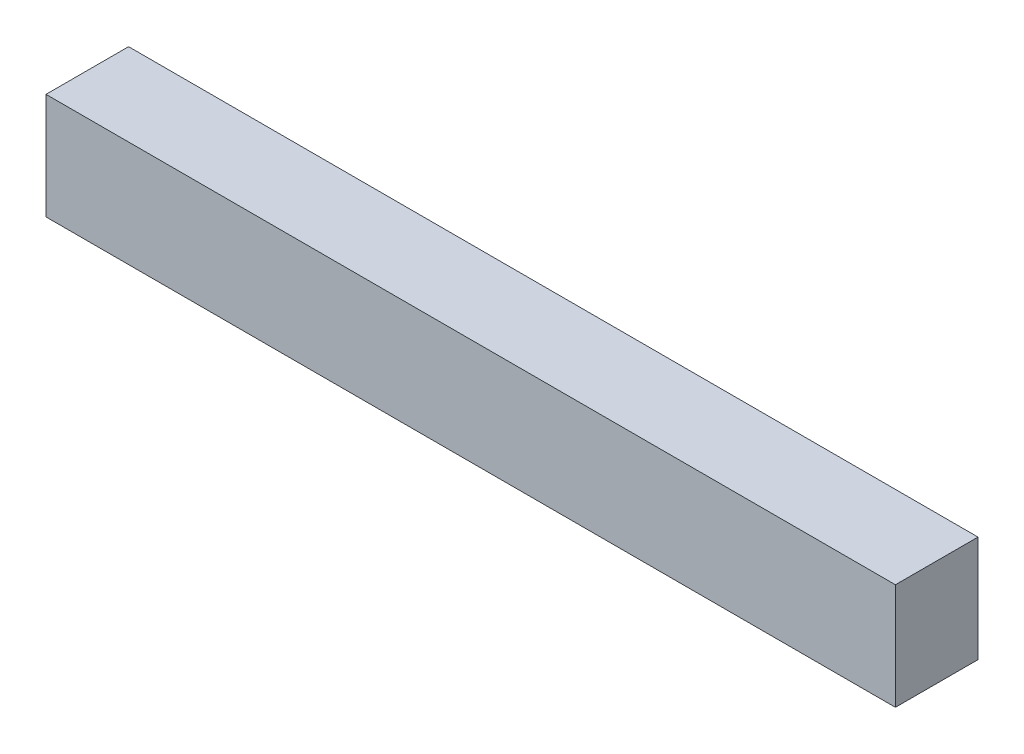
ISO-10303-21;
HEADER;
FILE_DESCRIPTION(('STEP AP214'),'2;1');
FILE_NAME('part.step','',(''),(''),'','','');
FILE_SCHEMA(('AUTOMOTIVE_DESIGN { 1 0 10303 214 1 1 1 1 }'));
ENDSEC;
DATA;
#1=APPLICATION_CONTEXT('core data for automotive mechanical design processes');
#2=APPLICATION_PROTOCOL_DEFINITION('international standard','automotive_design',2000,#1);
#3=PRODUCT_CONTEXT('',#1,'mechanical');
#4=PRODUCT('Part','Part','',(#3));
#5=PRODUCT_RELATED_PRODUCT_CATEGORY('part','',(#4));
#6=PRODUCT_DEFINITION_FORMATION('','',#4);
#7=PRODUCT_DEFINITION_CONTEXT('part definition',#1,'design');
#8=PRODUCT_DEFINITION('design','',#6,#7);
#9=PRODUCT_DEFINITION_SHAPE('','',#8);
#10=(LENGTH_UNIT() NAMED_UNIT(*) SI_UNIT(.MILLI.,.METRE.));
#11=(NAMED_UNIT(*) PLANE_ANGLE_UNIT() SI_UNIT($,.RADIAN.));
#12=(NAMED_UNIT(*) SI_UNIT($,.STERADIAN.) SOLID_ANGLE_UNIT());
#13=UNCERTAINTY_MEASURE_WITH_UNIT(LENGTH_MEASURE(1.E-05),#10,'distance_accuracy_value','');
#14=(GEOMETRIC_REPRESENTATION_CONTEXT(3) GLOBAL_UNCERTAINTY_ASSIGNED_CONTEXT((#13)) GLOBAL_UNIT_ASSIGNED_CONTEXT((#10,
#11,#12)) REPRESENTATION_CONTEXT('',''));
#15=CARTESIAN_POINT('',(0.,0.,0.));
#16=DIRECTION('',(0.,0.,1.));
#17=DIRECTION('',(1.,0.,0.));
#18=AXIS2_PLACEMENT_3D('',#15,#16,#17);
#19=CARTESIAN_POINT('',(180.,-22.5,35.));
#20=DIRECTION('',(-1.,0.,0.));
#21=DIRECTION('',(0.,0.,1.));
#22=AXIS2_PLACEMENT_3D('',#19,#20,#21);
#23=PLANE('',#22);
#24=DIRECTION('',(0.,1.,0.));
#25=VECTOR('',#24,1.);
#26=CARTESIAN_POINT('',(180.,-22.5,0.));
#27=LINE('',#26,#25);
#28=CARTESIAN_POINT('',(180.,-22.5,0.));
#29=VERTEX_POINT('',#28);
#30=CARTESIAN_POINT('',(180.,22.5,0.));
#31=VERTEX_POINT('',#30);
#32=EDGE_CURVE('E113',#29,#31,#27,.T.);
#33=ORIENTED_EDGE('',*,*,#32,.T.);
#34=DIRECTION('',(0.,0.,-1.));
#35=VECTOR('',#34,1.);
#36=CARTESIAN_POINT('',(180.,22.5,35.));
#37=LINE('',#36,#35);
#38=CARTESIAN_POINT('',(180.,22.5,35.));
#39=VERTEX_POINT('',#38);
#40=EDGE_CURVE('E11',#39,#31,#37,.T.);
#41=ORIENTED_EDGE('',*,*,#40,.F.);
#42=DIRECTION('',(0.,1.,0.));
#43=VECTOR('',#42,1.);
#44=CARTESIAN_POINT('',(180.,-22.5,35.));
#45=LINE('',#44,#43);
#46=CARTESIAN_POINT('',(180.,-22.5,35.));
#47=VERTEX_POINT('',#46);
#48=EDGE_CURVE('E97',#47,#39,#45,.T.);
#49=ORIENTED_EDGE('',*,*,#48,.F.);
#50=DIRECTION('',(0.,0.,-1.));
#51=VECTOR('',#50,1.);
#52=CARTESIAN_POINT('',(180.,-22.5,35.));
#53=LINE('',#52,#51);
#54=EDGE_CURVE('E109',#47,#29,#53,.T.);
#55=ORIENTED_EDGE('',*,*,#54,.T.);
#56=EDGE_LOOP('',(#33,#41,#49,#55));
#57=FACE_BOUND('',#56,.T.);
#58=ADVANCED_FACE('F45',(#57),#23,.F.);
#59=CARTESIAN_POINT('',(-180.,22.5,35.));
#60=DIRECTION('',(0.,-1.,0.));
#61=DIRECTION('',(0.,0.,-1.));
#62=AXIS2_PLACEMENT_3D('',#59,#60,#61);
#63=PLANE('',#62);
#64=DIRECTION('',(-1.,0.,0.));
#65=VECTOR('',#64,1.);
#66=CARTESIAN_POINT('',(-180.,22.5,0.));
#67=LINE('',#66,#65);
#68=CARTESIAN_POINT('',(-180.,22.5,0.));
#69=VERTEX_POINT('',#68);
#70=EDGE_CURVE('E102',#31,#69,#67,.T.);
#71=ORIENTED_EDGE('',*,*,#70,.T.);
#72=DIRECTION('',(0.,0.,-1.));
#73=VECTOR('',#72,1.);
#74=CARTESIAN_POINT('',(-180.,22.5,35.));
#75=LINE('',#74,#73);
#76=CARTESIAN_POINT('',(-180.,22.5,35.));
#77=VERTEX_POINT('',#76);
#78=EDGE_CURVE('E54',#77,#69,#75,.T.);
#79=ORIENTED_EDGE('',*,*,#78,.F.);
#80=DIRECTION('',(-1.,0.,0.));
#81=VECTOR('',#80,1.);
#82=CARTESIAN_POINT('',(-180.,22.5,35.));
#83=LINE('',#82,#81);
#84=EDGE_CURVE('E92',#39,#77,#83,.T.);
#85=ORIENTED_EDGE('',*,*,#84,.F.);
#86=ORIENTED_EDGE('',*,*,#40,.T.);
#87=EDGE_LOOP('',(#71,#79,#85,#86));
#88=FACE_BOUND('',#87,.T.);
#89=ADVANCED_FACE('F101',(#88),#63,.F.);
#90=CARTESIAN_POINT('',(-180.,-22.5,35.));
#91=DIRECTION('',(1.,0.,0.));
#92=DIRECTION('',(0.,0.,-1.));
#93=AXIS2_PLACEMENT_3D('',#90,#91,#92);
#94=PLANE('',#93);
#95=DIRECTION('',(0.,-1.,0.));
#96=VECTOR('',#95,1.);
#97=CARTESIAN_POINT('',(-180.,-22.5,0.));
#98=LINE('',#97,#96);
#99=CARTESIAN_POINT('',(-180.,-22.5,0.));
#100=VERTEX_POINT('',#99);
#101=EDGE_CURVE('E79',#69,#100,#98,.T.);
#102=ORIENTED_EDGE('',*,*,#101,.T.);
#103=DIRECTION('',(0.,0.,-1.));
#104=VECTOR('',#103,1.);
#105=CARTESIAN_POINT('',(-180.,-22.5,35.));
#106=LINE('',#105,#104);
#107=CARTESIAN_POINT('',(-180.,-22.5,35.));
#108=VERTEX_POINT('',#107);
#109=EDGE_CURVE('E104',#108,#100,#106,.T.);
#110=ORIENTED_EDGE('',*,*,#109,.F.);
#111=DIRECTION('',(0.,-1.,0.));
#112=VECTOR('',#111,1.);
#113=CARTESIAN_POINT('',(-180.,-22.5,35.));
#114=LINE('',#113,#112);
#115=EDGE_CURVE('E95',#77,#108,#114,.T.);
#116=ORIENTED_EDGE('',*,*,#115,.F.);
#117=ORIENTED_EDGE('',*,*,#78,.T.);
#118=EDGE_LOOP('',(#102,#110,#116,#117));
#119=FACE_BOUND('',#118,.T.);
#120=ADVANCED_FACE('F105',(#119),#94,.F.);
#121=CARTESIAN_POINT('',(-180.,-22.5,35.));
#122=DIRECTION('',(0.,1.,0.));
#123=DIRECTION('',(0.,0.,1.));
#124=AXIS2_PLACEMENT_3D('',#121,#122,#123);
#125=PLANE('',#124);
#126=DIRECTION('',(1.,0.,0.));
#127=VECTOR('',#126,1.);
#128=CARTESIAN_POINT('',(-180.,-22.5,0.));
#129=LINE('',#128,#127);
#130=EDGE_CURVE('E85',#100,#29,#129,.T.);
#131=ORIENTED_EDGE('',*,*,#130,.T.);
#132=ORIENTED_EDGE('',*,*,#54,.F.);
#133=DIRECTION('',(1.,0.,0.));
#134=VECTOR('',#133,1.);
#135=CARTESIAN_POINT('',(-180.,-22.5,35.));
#136=LINE('',#135,#134);
#137=EDGE_CURVE('E62',#108,#47,#136,.T.);
#138=ORIENTED_EDGE('',*,*,#137,.F.);
#139=ORIENTED_EDGE('',*,*,#109,.T.);
#140=EDGE_LOOP('',(#131,#132,#138,#139));
#141=FACE_BOUND('',#140,.T.);
#142=ADVANCED_FACE('F126',(#141),#125,.F.);
#143=CARTESIAN_POINT('',(0.,0.,35.));
#144=DIRECTION('',(0.,0.,-1.));
#145=DIRECTION('',(-1.,0.,0.));
#146=AXIS2_PLACEMENT_3D('',#143,#144,#145);
#147=PLANE('',#146);
#148=ORIENTED_EDGE('',*,*,#48,.T.);
#149=ORIENTED_EDGE('',*,*,#84,.T.);
#150=ORIENTED_EDGE('',*,*,#115,.T.);
#151=ORIENTED_EDGE('',*,*,#137,.T.);
#152=EDGE_LOOP('',(#148,#149,#150,#151));
#153=FACE_BOUND('',#152,.T.);
#154=ADVANCED_FACE('F93',(#153),#147,.F.);
#155=CARTESIAN_POINT('',(0.,0.,0.));
#156=DIRECTION('',(0.,0.,-1.));
#157=DIRECTION('',(-1.,0.,0.));
#158=AXIS2_PLACEMENT_3D('',#155,#156,#157);
#159=PLANE('',#158);
#160=ORIENTED_EDGE('',*,*,#32,.F.);
#161=ORIENTED_EDGE('',*,*,#130,.F.);
#162=ORIENTED_EDGE('',*,*,#101,.F.);
#163=ORIENTED_EDGE('',*,*,#70,.F.);
#164=EDGE_LOOP('',(#160,#161,#162,#163));
#165=FACE_BOUND('',#164,.T.);
#166=ADVANCED_FACE('F129',(#165),#159,.T.);
#167=CLOSED_SHELL('',(#58,#89,#120,#142,#154,#166));
#168=MANIFOLD_SOLID_BREP('B2',#167);
#169=ADVANCED_BREP_SHAPE_REPRESENTATION('',(#18,#168),#14);
#170=SHAPE_DEFINITION_REPRESENTATION(#9,#169);
ENDSEC;
END-ISO-10303-21;
